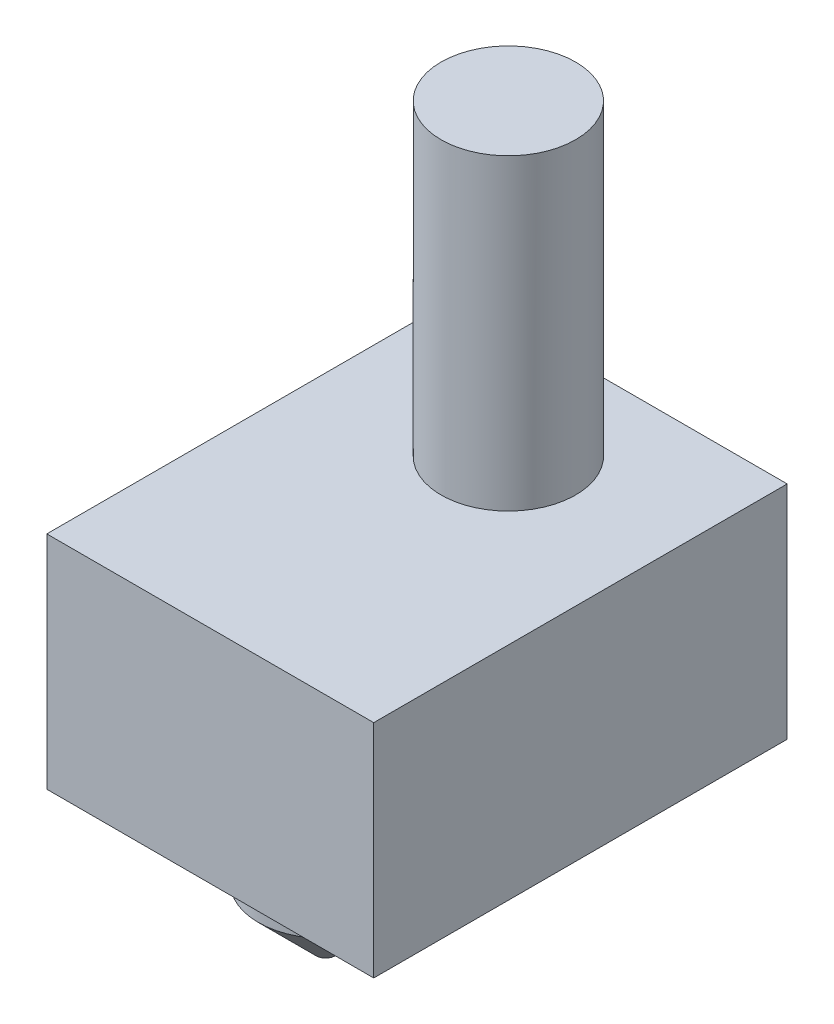
ISO-10303-21;
HEADER;
FILE_DESCRIPTION(('STEP AP214'),'2;1');
FILE_NAME('part.step','',(''),(''),'','','');
FILE_SCHEMA(('AUTOMOTIVE_DESIGN { 1 0 10303 214 1 1 1 1 }'));
ENDSEC;
DATA;
#1=APPLICATION_CONTEXT('core data for automotive mechanical design processes');
#2=APPLICATION_PROTOCOL_DEFINITION('international standard','automotive_design',2000,#1);
#3=PRODUCT_CONTEXT('',#1,'mechanical');
#4=PRODUCT('Part','Part','',(#3));
#5=PRODUCT_RELATED_PRODUCT_CATEGORY('part','',(#4));
#6=PRODUCT_DEFINITION_FORMATION('','',#4);
#7=PRODUCT_DEFINITION_CONTEXT('part definition',#1,'design');
#8=PRODUCT_DEFINITION('design','',#6,#7);
#9=PRODUCT_DEFINITION_SHAPE('','',#8);
#10=(LENGTH_UNIT() NAMED_UNIT(*) SI_UNIT(.MILLI.,.METRE.));
#11=(NAMED_UNIT(*) PLANE_ANGLE_UNIT() SI_UNIT($,.RADIAN.));
#12=(NAMED_UNIT(*) SI_UNIT($,.STERADIAN.) SOLID_ANGLE_UNIT());
#13=UNCERTAINTY_MEASURE_WITH_UNIT(LENGTH_MEASURE(1.E-05),#10,'distance_accuracy_value','');
#14=(GEOMETRIC_REPRESENTATION_CONTEXT(3) GLOBAL_UNCERTAINTY_ASSIGNED_CONTEXT((#13)) GLOBAL_UNIT_ASSIGNED_CONTEXT((#10,
#11,#12)) REPRESENTATION_CONTEXT('',''));
#15=CARTESIAN_POINT('',(0.,0.,0.));
#16=DIRECTION('',(0.,0.,1.));
#17=DIRECTION('',(1.,0.,0.));
#18=AXIS2_PLACEMENT_3D('',#15,#16,#17);
#19=CARTESIAN_POINT('',(0.,0.,0.));
#20=DIRECTION('',(0.,-1.,0.));
#21=DIRECTION('',(0.,0.,-1.));
#22=AXIS2_PLACEMENT_3D('',#19,#20,#21);
#23=PLANE('',#22);
#24=DIRECTION('',(0.,0.,1.));
#25=VECTOR('',#24,1.);
#26=CARTESIAN_POINT('',(0.,0.,0.));
#27=LINE('',#26,#25);
#28=CARTESIAN_POINT('',(0.,0.,-21.5));
#29=VERTEX_POINT('',#28);
#30=CARTESIAN_POINT('',(0.,0.,0.));
#31=VERTEX_POINT('',#30);
#32=EDGE_CURVE('E102',#29,#31,#27,.T.);
#33=ORIENTED_EDGE('',*,*,#32,.F.);
#34=DIRECTION('',(-1.,0.,0.));
#35=VECTOR('',#34,1.);
#36=CARTESIAN_POINT('',(0.,0.,-21.5));
#37=LINE('',#36,#35);
#38=CARTESIAN_POINT('',(17.,0.,-21.5));
#39=VERTEX_POINT('',#38);
#40=EDGE_CURVE('E73',#39,#29,#37,.T.);
#41=ORIENTED_EDGE('',*,*,#40,.F.);
#42=DIRECTION('',(0.,0.,-1.));
#43=VECTOR('',#42,1.);
#44=CARTESIAN_POINT('',(17.,0.,0.));
#45=LINE('',#44,#43);
#46=CARTESIAN_POINT('',(17.,0.,0.));
#47=VERTEX_POINT('',#46);
#48=EDGE_CURVE('E67',#47,#39,#45,.T.);
#49=ORIENTED_EDGE('',*,*,#48,.F.);
#50=DIRECTION('',(1.,0.,0.));
#51=VECTOR('',#50,1.);
#52=CARTESIAN_POINT('',(0.,0.,0.));
#53=LINE('',#52,#51);
#54=EDGE_CURVE('E92',#31,#47,#53,.T.);
#55=ORIENTED_EDGE('',*,*,#54,.F.);
#56=EDGE_LOOP('',(#33,#41,#49,#55));
#57=FACE_BOUND('',#56,.T.);
#58=CARTESIAN_POINT('',(8.5,0.,-6.));
#59=DIRECTION('',(0.,-1.,0.));
#60=DIRECTION('',(0.,0.,-1.));
#61=AXIS2_PLACEMENT_3D('',#58,#59,#60);
#62=CIRCLE('',#61,3.5);
#63=CARTESIAN_POINT('',(8.5,0.,-9.5));
#64=VERTEX_POINT('',#63);
#65=EDGE_CURVE('E153',#64,#64,#62,.T.);
#66=ORIENTED_EDGE('',*,*,#65,.F.);
#67=EDGE_LOOP('',(#66));
#68=FACE_BOUND('',#67,.T.);
#69=ADVANCED_FACE('F33',(#57,#68),#23,.T.);
#70=CARTESIAN_POINT('',(0.,11.5,0.));
#71=DIRECTION('',(0.,-1.,0.));
#72=DIRECTION('',(0.,0.,-1.));
#73=AXIS2_PLACEMENT_3D('',#70,#71,#72);
#74=PLANE('',#73);
#75=DIRECTION('',(0.,0.,1.));
#76=VECTOR('',#75,1.);
#77=CARTESIAN_POINT('',(0.,11.5,0.));
#78=LINE('',#77,#76);
#79=CARTESIAN_POINT('',(0.,11.5,-21.5));
#80=VERTEX_POINT('',#79);
#81=CARTESIAN_POINT('',(0.,11.5,0.));
#82=VERTEX_POINT('',#81);
#83=EDGE_CURVE('E87',#80,#82,#78,.T.);
#84=ORIENTED_EDGE('',*,*,#83,.T.);
#85=DIRECTION('',(1.,0.,0.));
#86=VECTOR('',#85,1.);
#87=CARTESIAN_POINT('',(0.,11.5,0.));
#88=LINE('',#87,#86);
#89=CARTESIAN_POINT('',(17.,11.5,0.));
#90=VERTEX_POINT('',#89);
#91=EDGE_CURVE('E81',#82,#90,#88,.T.);
#92=ORIENTED_EDGE('',*,*,#91,.T.);
#93=DIRECTION('',(0.,0.,-1.));
#94=VECTOR('',#93,1.);
#95=CARTESIAN_POINT('',(17.,11.5,0.));
#96=LINE('',#95,#94);
#97=CARTESIAN_POINT('',(17.,11.5,-21.5));
#98=VERTEX_POINT('',#97);
#99=EDGE_CURVE('E85',#90,#98,#96,.T.);
#100=ORIENTED_EDGE('',*,*,#99,.T.);
#101=DIRECTION('',(-1.,0.,0.));
#102=VECTOR('',#101,1.);
#103=CARTESIAN_POINT('',(0.,11.5,-21.5));
#104=LINE('',#103,#102);
#105=EDGE_CURVE('E50',#98,#80,#104,.T.);
#106=ORIENTED_EDGE('',*,*,#105,.T.);
#107=EDGE_LOOP('',(#84,#92,#100,#106));
#108=FACE_BOUND('',#107,.T.);
#109=CARTESIAN_POINT('',(8.5,11.5,-15.5));
#110=DIRECTION('',(0.,-1.,0.));
#111=DIRECTION('',(0.,0.,-1.));
#112=AXIS2_PLACEMENT_3D('',#109,#110,#111);
#113=CIRCLE('',#112,3.5);
#114=CARTESIAN_POINT('',(8.5,11.5,-19.));
#115=VERTEX_POINT('',#114);
#116=EDGE_CURVE('E112',#115,#115,#113,.F.);
#117=ORIENTED_EDGE('',*,*,#116,.F.);
#118=EDGE_LOOP('',(#117));
#119=FACE_BOUND('',#118,.T.);
#120=ADVANCED_FACE('F82',(#108,#119),#74,.F.);
#121=CARTESIAN_POINT('',(0.,11.5,0.));
#122=DIRECTION('',(1.,0.,0.));
#123=DIRECTION('',(0.,0.,-1.));
#124=AXIS2_PLACEMENT_3D('',#121,#122,#123);
#125=PLANE('',#124);
#126=ORIENTED_EDGE('',*,*,#32,.T.);
#127=DIRECTION('',(0.,-1.,0.));
#128=VECTOR('',#127,1.);
#129=CARTESIAN_POINT('',(0.,11.5,0.));
#130=LINE('',#129,#128);
#131=EDGE_CURVE('E93',#82,#31,#130,.T.);
#132=ORIENTED_EDGE('',*,*,#131,.F.);
#133=ORIENTED_EDGE('',*,*,#83,.F.);
#134=DIRECTION('',(0.,-1.,0.));
#135=VECTOR('',#134,1.);
#136=CARTESIAN_POINT('',(0.,11.5,-21.5));
#137=LINE('',#136,#135);
#138=EDGE_CURVE('E98',#80,#29,#137,.T.);
#139=ORIENTED_EDGE('',*,*,#138,.T.);
#140=EDGE_LOOP('',(#126,#132,#133,#139));
#141=FACE_BOUND('',#140,.T.);
#142=ADVANCED_FACE('F133',(#141),#125,.F.);
#143=CARTESIAN_POINT('',(0.,11.5,0.));
#144=DIRECTION('',(0.,0.,-1.));
#145=DIRECTION('',(-1.,0.,0.));
#146=AXIS2_PLACEMENT_3D('',#143,#144,#145);
#147=PLANE('',#146);
#148=ORIENTED_EDGE('',*,*,#54,.T.);
#149=DIRECTION('',(0.,-1.,0.));
#150=VECTOR('',#149,1.);
#151=CARTESIAN_POINT('',(17.,11.5,0.));
#152=LINE('',#151,#150);
#153=EDGE_CURVE('E90',#90,#47,#152,.T.);
#154=ORIENTED_EDGE('',*,*,#153,.F.);
#155=ORIENTED_EDGE('',*,*,#91,.F.);
#156=ORIENTED_EDGE('',*,*,#131,.T.);
#157=EDGE_LOOP('',(#148,#154,#155,#156));
#158=FACE_BOUND('',#157,.T.);
#159=ADVANCED_FACE('F91',(#158),#147,.F.);
#160=CARTESIAN_POINT('',(17.,11.5,0.));
#161=DIRECTION('',(-1.,0.,0.));
#162=DIRECTION('',(0.,0.,1.));
#163=AXIS2_PLACEMENT_3D('',#160,#161,#162);
#164=PLANE('',#163);
#165=ORIENTED_EDGE('',*,*,#48,.T.);
#166=DIRECTION('',(0.,-1.,0.));
#167=VECTOR('',#166,1.);
#168=CARTESIAN_POINT('',(17.,11.5,-21.5));
#169=LINE('',#168,#167);
#170=EDGE_CURVE('E94',#98,#39,#169,.T.);
#171=ORIENTED_EDGE('',*,*,#170,.F.);
#172=ORIENTED_EDGE('',*,*,#99,.F.);
#173=ORIENTED_EDGE('',*,*,#153,.T.);
#174=EDGE_LOOP('',(#165,#171,#172,#173));
#175=FACE_BOUND('',#174,.T.);
#176=ADVANCED_FACE('F96',(#175),#164,.F.);
#177=CARTESIAN_POINT('',(0.,11.5,-21.5));
#178=DIRECTION('',(0.,0.,1.));
#179=DIRECTION('',(1.,0.,0.));
#180=AXIS2_PLACEMENT_3D('',#177,#178,#179);
#181=PLANE('',#180);
#182=ORIENTED_EDGE('',*,*,#40,.T.);
#183=ORIENTED_EDGE('',*,*,#138,.F.);
#184=ORIENTED_EDGE('',*,*,#105,.F.);
#185=ORIENTED_EDGE('',*,*,#170,.T.);
#186=EDGE_LOOP('',(#182,#183,#184,#185));
#187=FACE_BOUND('',#186,.T.);
#188=ADVANCED_FACE('F139',(#187),#181,.F.);
#189=CARTESIAN_POINT('',(8.5,27.5,-15.5));
#190=DIRECTION('',(0.,-1.,0.));
#191=DIRECTION('',(0.,0.,-1.));
#192=AXIS2_PLACEMENT_3D('',#189,#190,#191);
#193=CYLINDRICAL_SURFACE('',#192,3.5);
#194=CARTESIAN_POINT('',(8.5,27.5,-15.5));
#195=DIRECTION('',(0.,1.,0.));
#196=DIRECTION('',(0.,0.,1.));
#197=AXIS2_PLACEMENT_3D('',#194,#195,#196);
#198=CIRCLE('',#197,3.5);
#199=CARTESIAN_POINT('',(8.5,27.5,-12.));
#200=VERTEX_POINT('',#199);
#201=EDGE_CURVE('E105',#200,#200,#198,.T.);
#202=ORIENTED_EDGE('',*,*,#201,.F.);
#203=EDGE_LOOP('',(#202));
#204=FACE_BOUND('',#203,.T.);
#205=ORIENTED_EDGE('',*,*,#116,.T.);
#206=EDGE_LOOP('',(#205));
#207=FACE_BOUND('',#206,.T.);
#208=ADVANCED_FACE('F142',(#204,#207),#193,.T.);
#209=CARTESIAN_POINT('',(8.5,27.5,-15.5));
#210=DIRECTION('',(0.,1.,0.));
#211=DIRECTION('',(0.,0.,1.));
#212=AXIS2_PLACEMENT_3D('',#209,#210,#211);
#213=PLANE('',#212);
#214=ORIENTED_EDGE('',*,*,#201,.T.);
#215=EDGE_LOOP('',(#214));
#216=FACE_BOUND('',#215,.T.);
#217=ADVANCED_FACE('F158',(#216),#213,.T.);
#218=CARTESIAN_POINT('',(8.5,-6.,-6.));
#219=DIRECTION('',(0.,1.,0.));
#220=DIRECTION('',(0.,0.,1.));
#221=AXIS2_PLACEMENT_3D('',#218,#219,#220);
#222=CYLINDRICAL_SURFACE('',#221,3.5);
#223=CARTESIAN_POINT('',(8.5,-2.99999999999998,-6.));
#224=DIRECTION('',(0.,-1.,0.));
#225=DIRECTION('',(0.,0.,-1.));
#226=AXIS2_PLACEMENT_3D('',#223,#224,#225);
#227=CIRCLE('',#226,3.5);
#228=CARTESIAN_POINT('',(8.5,-2.99999999999998,-2.5));
#229=VERTEX_POINT('',#228);
#230=EDGE_CURVE('E11',#229,#229,#227,.F.);
#231=ORIENTED_EDGE('',*,*,#230,.T.);
#232=EDGE_LOOP('',(#231));
#233=FACE_BOUND('',#232,.T.);
#234=ORIENTED_EDGE('',*,*,#65,.T.);
#235=EDGE_LOOP('',(#234));
#236=FACE_BOUND('',#235,.T.);
#237=ADVANCED_FACE('F124',(#233,#236),#222,.T.);
#238=CARTESIAN_POINT('',(8.5,-6.,-6.));
#239=DIRECTION('',(0.,-1.,0.));
#240=DIRECTION('',(0.,0.,-1.));
#241=AXIS2_PLACEMENT_3D('',#238,#239,#240);
#242=PLANE('',#241);
#243=CARTESIAN_POINT('',(8.5,-6.,-6.));
#244=DIRECTION('',(0.,-1.,0.));
#245=DIRECTION('',(0.,0.,-1.));
#246=AXIS2_PLACEMENT_3D('',#243,#244,#245);
#247=CIRCLE('',#246,0.499999999999994);
#248=CARTESIAN_POINT('',(8.5,-6.,-5.50000000000001));
#249=VERTEX_POINT('',#248);
#250=EDGE_CURVE('E42',#249,#249,#247,.T.);
#251=ORIENTED_EDGE('',*,*,#250,.T.);
#252=EDGE_LOOP('',(#251));
#253=FACE_BOUND('',#252,.T.);
#254=ADVANCED_FACE('F117',(#253),#242,.T.);
#255=CARTESIAN_POINT('',(8.5,-6.,-6.));
#256=DIRECTION('',(0.,1.,0.));
#257=DIRECTION('',(0.,0.,1.));
#258=AXIS2_PLACEMENT_3D('',#255,#256,#257);
#259=CONICAL_SURFACE('',#258,0.499999999999994,0.785398163397446);
#260=CARTESIAN_POINT('',(8.5,-2.99999999999998,-2.5));
#261=CARTESIAN_POINT('',(8.5,-3.03124999999998,-2.53125));
#262=CARTESIAN_POINT('',(8.5,-3.06249999999998,-2.5625));
#263=CARTESIAN_POINT('',(8.5,-3.12499999999998,-2.625));
#264=CARTESIAN_POINT('',(8.5,-3.15624999999998,-2.65625));
#265=CARTESIAN_POINT('',(8.5,-3.21874999999998,-2.71875));
#266=CARTESIAN_POINT('',(8.5,-3.24999999999998,-2.75));
#267=CARTESIAN_POINT('',(8.5,-3.31249999999998,-2.8125));
#268=CARTESIAN_POINT('',(8.5,-3.34374999999998,-2.84375));
#269=CARTESIAN_POINT('',(8.5,-3.40624999999998,-2.90625));
#270=CARTESIAN_POINT('',(8.5,-3.43749999999998,-2.9375));
#271=CARTESIAN_POINT('',(8.5,-3.49999999999998,-3.));
#272=CARTESIAN_POINT('',(8.5,-3.53124999999998,-3.03125));
#273=CARTESIAN_POINT('',(8.5,-3.59374999999999,-3.09375));
#274=CARTESIAN_POINT('',(8.5,-3.62499999999999,-3.125));
#275=CARTESIAN_POINT('',(8.5,-3.68749999999999,-3.1875));
#276=CARTESIAN_POINT('',(8.5,-3.71874999999999,-3.21875));
#277=CARTESIAN_POINT('',(8.5,-3.78124999999999,-3.28125));
#278=CARTESIAN_POINT('',(8.5,-3.81249999999999,-3.3125));
#279=CARTESIAN_POINT('',(8.5,-3.87499999999999,-3.375));
#280=CARTESIAN_POINT('',(8.5,-3.90624999999999,-3.40625));
#281=CARTESIAN_POINT('',(8.5,-3.96874999999999,-3.46875));
#282=CARTESIAN_POINT('',(8.5,-3.99999999999999,-3.5));
#283=CARTESIAN_POINT('',(8.5,-4.06249999999999,-3.5625));
#284=CARTESIAN_POINT('',(8.5,-4.09374999999999,-3.59375));
#285=CARTESIAN_POINT('',(8.5,-4.15624999999999,-3.65625));
#286=CARTESIAN_POINT('',(8.5,-4.18749999999999,-3.6875));
#287=CARTESIAN_POINT('',(8.5,-4.24999999999999,-3.75));
#288=CARTESIAN_POINT('',(8.5,-4.28124999999999,-3.78125));
#289=CARTESIAN_POINT('',(8.5,-4.34374999999999,-3.84375));
#290=CARTESIAN_POINT('',(8.5,-4.37499999999999,-3.875));
#291=CARTESIAN_POINT('',(8.5,-4.43749999999999,-3.9375));
#292=CARTESIAN_POINT('',(8.5,-4.46874999999999,-3.96875));
#293=CARTESIAN_POINT('',(8.5,-4.53124999999999,-4.03125));
#294=CARTESIAN_POINT('',(8.5,-4.56249999999999,-4.0625));
#295=CARTESIAN_POINT('',(8.5,-4.62499999999999,-4.125));
#296=CARTESIAN_POINT('',(8.5,-4.65624999999999,-4.15625));
#297=CARTESIAN_POINT('',(8.5,-4.71874999999999,-4.21875));
#298=CARTESIAN_POINT('',(8.5,-4.74999999999999,-4.25));
#299=CARTESIAN_POINT('',(8.5,-4.81249999999999,-4.3125));
#300=CARTESIAN_POINT('',(8.5,-4.84374999999999,-4.34375));
#301=CARTESIAN_POINT('',(8.5,-4.90624999999999,-4.40625));
#302=CARTESIAN_POINT('',(8.5,-4.93749999999999,-4.4375));
#303=CARTESIAN_POINT('',(8.5,-4.99999999999999,-4.5));
#304=CARTESIAN_POINT('',(8.5,-5.03124999999999,-4.53125));
#305=CARTESIAN_POINT('',(8.5,-5.09374999999999,-4.59375));
#306=CARTESIAN_POINT('',(8.5,-5.12499999999999,-4.625));
#307=CARTESIAN_POINT('',(8.5,-5.18749999999999,-4.6875));
#308=CARTESIAN_POINT('',(8.5,-5.21874999999999,-4.71875));
#309=CARTESIAN_POINT('',(8.5,-5.28125,-4.78125));
#310=CARTESIAN_POINT('',(8.5,-5.3125,-4.8125));
#311=CARTESIAN_POINT('',(8.5,-5.375,-4.875));
#312=CARTESIAN_POINT('',(8.5,-5.40625,-4.90625));
#313=CARTESIAN_POINT('',(8.5,-5.46875,-4.96875));
#314=CARTESIAN_POINT('',(8.5,-5.5,-5.));
#315=CARTESIAN_POINT('',(8.5,-5.5625,-5.0625));
#316=CARTESIAN_POINT('',(8.5,-5.59375,-5.09375));
#317=CARTESIAN_POINT('',(8.5,-5.65625,-5.15625));
#318=CARTESIAN_POINT('',(8.5,-5.6875,-5.1875));
#319=CARTESIAN_POINT('',(8.5,-5.75,-5.25));
#320=CARTESIAN_POINT('',(8.5,-5.78125,-5.28125));
#321=CARTESIAN_POINT('',(8.5,-5.84375,-5.34375));
#322=CARTESIAN_POINT('',(8.5,-5.875,-5.375));
#323=CARTESIAN_POINT('',(8.5,-5.9375,-5.4375));
#324=CARTESIAN_POINT('',(8.5,-5.96875,-5.46875));
#325=CARTESIAN_POINT('',(8.5,-6.,-5.50000000000001));
#326=B_SPLINE_CURVE_WITH_KNOTS('',3,(#260,#261,#262,#263,#264,#265,#266,#267,#268,#269,#270,
#271,#272,#273,#274,#275,#276,#277,#278,#279,#280,#281,#282,#283,#284,#285,#286,#287,#288,#289,
#290,#291,#292,#293,#294,#295,#296,#297,#298,#299,#300,#301,#302,#303,#304,#305,#306,#307,#308,
#309,#310,#311,#312,#313,#314,#315,#316,#317,#318,#319,#320,#321,#322,#323,#324,#325),
.UNSPECIFIED.,.F.,.F.,(4,2,2,2,2,2,2,2,2,2,2,2,2,2,2,2,2,2,2,2,2,2,2,2,2,2,2,2,2,2,2,2,4),(0.,
0.132582521472478,0.265165042944956,0.397747564417435,0.530330085889913,0.662912607362391,
0.795495128834869,0.928077650307347,1.06066017177983,1.1932426932523,1.32582521472478,
1.45840773619726,1.59099025766974,1.72357277914222,1.8561553006147,1.98873782208717,
2.12132034355965,2.25390286503213,2.38648538650461,2.51906790797709,2.65165042944956,
2.78423295092204,2.91681547239452,3.049397993867,3.18198051533948,3.31456303681195,
3.44714555828443,3.57972807975691,3.71231060122939,3.84489312270187,3.97747564417435,
4.11005816564682,4.2426406871193),.UNSPECIFIED.);
#327=EDGE_CURVE('BSEAM35',#229,#249,#326,.T.);
#328=ORIENTED_EDGE('',*,*,#230,.F.);
#329=ORIENTED_EDGE('',*,*,#250,.F.);
#330=ORIENTED_EDGE('',*,*,#327,.T.);
#331=ORIENTED_EDGE('',*,*,#327,.F.);
#332=EDGE_LOOP('',(#328,#330,#329,#331));
#333=FACE_BOUND('',#332,.T.);
#334=ADVANCED_FACE('F35',(#333),#259,.T.);
#335=CLOSED_SHELL('',(#69,#120,#142,#159,#176,#188,#208,#217,#237,#254,#334));
#336=MANIFOLD_SOLID_BREP('B2',#335);
#337=ADVANCED_BREP_SHAPE_REPRESENTATION('',(#18,#336),#14);
#338=SHAPE_DEFINITION_REPRESENTATION(#9,#337);
ENDSEC;
END-ISO-10303-21;
